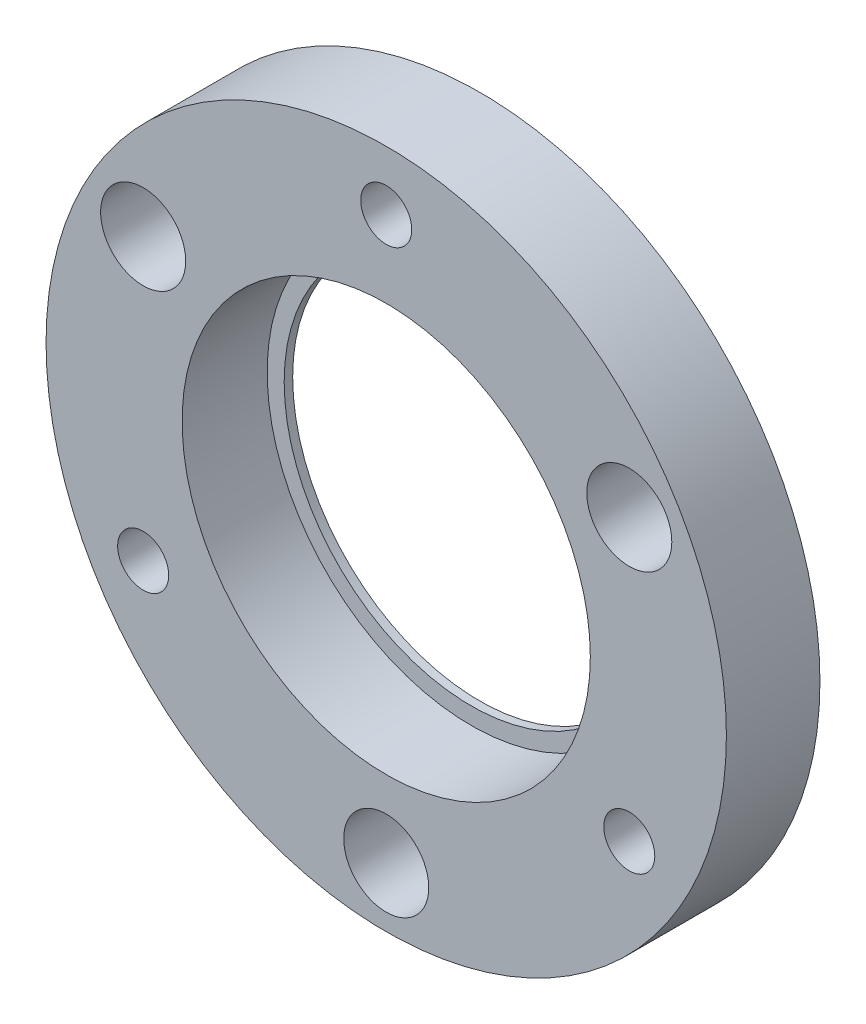
ISO-10303-21;
HEADER;
FILE_DESCRIPTION(('STEP AP214'),'2;1');
FILE_NAME('part.step','',(''),(''),'','','');
FILE_SCHEMA(('AUTOMOTIVE_DESIGN { 1 0 10303 214 1 1 1 1 }'));
ENDSEC;
DATA;
#1=APPLICATION_CONTEXT('core data for automotive mechanical design processes');
#2=APPLICATION_PROTOCOL_DEFINITION('international standard','automotive_design',2000,#1);
#3=PRODUCT_CONTEXT('',#1,'mechanical');
#4=PRODUCT('Part','Part','',(#3));
#5=PRODUCT_RELATED_PRODUCT_CATEGORY('part','',(#4));
#6=PRODUCT_DEFINITION_FORMATION('','',#4);
#7=PRODUCT_DEFINITION_CONTEXT('part definition',#1,'design');
#8=PRODUCT_DEFINITION('design','',#6,#7);
#9=PRODUCT_DEFINITION_SHAPE('','',#8);
#10=(LENGTH_UNIT() NAMED_UNIT(*) SI_UNIT(.MILLI.,.METRE.));
#11=(NAMED_UNIT(*) PLANE_ANGLE_UNIT() SI_UNIT($,.RADIAN.));
#12=(NAMED_UNIT(*) SI_UNIT($,.STERADIAN.) SOLID_ANGLE_UNIT());
#13=UNCERTAINTY_MEASURE_WITH_UNIT(LENGTH_MEASURE(1.E-05),#10,'distance_accuracy_value','');
#14=(GEOMETRIC_REPRESENTATION_CONTEXT(3) GLOBAL_UNCERTAINTY_ASSIGNED_CONTEXT((#13)) GLOBAL_UNIT_ASSIGNED_CONTEXT((#10,
#11,#12)) REPRESENTATION_CONTEXT('',''));
#15=CARTESIAN_POINT('',(0.,0.,0.));
#16=DIRECTION('',(0.,0.,1.));
#17=DIRECTION('',(1.,0.,0.));
#18=AXIS2_PLACEMENT_3D('',#15,#16,#17);
#19=CARTESIAN_POINT('',(0.,0.,5.));
#20=DIRECTION('',(0.,0.,-1.));
#21=DIRECTION('',(-1.,0.,0.));
#22=AXIS2_PLACEMENT_3D('',#19,#20,#21);
#23=CYLINDRICAL_SURFACE('',#22,12.);
#24=CARTESIAN_POINT('',(0.,0.,5.));
#25=DIRECTION('',(0.,0.,1.));
#26=DIRECTION('',(1.,0.,0.));
#27=AXIS2_PLACEMENT_3D('',#24,#25,#26);
#28=CIRCLE('',#27,12.);
#29=CARTESIAN_POINT('',(12.,0.,5.));
#30=VERTEX_POINT('',#29);
#31=EDGE_CURVE('E50',#30,#30,#28,.T.);
#32=ORIENTED_EDGE('',*,*,#31,.T.);
#33=EDGE_LOOP('',(#32));
#34=FACE_BOUND('',#33,.T.);
#35=CARTESIAN_POINT('',(0.,0.,0.));
#36=DIRECTION('',(0.,0.,1.));
#37=DIRECTION('',(1.,0.,0.));
#38=AXIS2_PLACEMENT_3D('',#35,#36,#37);
#39=CIRCLE('',#38,12.);
#40=CARTESIAN_POINT('',(12.,0.,0.));
#41=VERTEX_POINT('',#40);
#42=EDGE_CURVE('E45',#41,#41,#39,.T.);
#43=ORIENTED_EDGE('',*,*,#42,.F.);
#44=EDGE_LOOP('',(#43));
#45=FACE_BOUND('',#44,.T.);
#46=ADVANCED_FACE('F41',(#34,#45),#23,.F.);
#47=CARTESIAN_POINT('',(0.,16.5,5.));
#48=DIRECTION('',(0.,0.,-1.));
#49=DIRECTION('',(-1.,0.,0.));
#50=AXIS2_PLACEMENT_3D('',#47,#48,#49);
#51=CYLINDRICAL_SURFACE('',#50,1.5);
#52=CARTESIAN_POINT('',(0.,16.5,5.));
#53=DIRECTION('',(0.,0.,1.));
#54=DIRECTION('',(1.,0.,0.));
#55=AXIS2_PLACEMENT_3D('',#52,#53,#54);
#56=CIRCLE('',#55,1.5);
#57=CARTESIAN_POINT('',(1.5,16.5,5.));
#58=VERTEX_POINT('',#57);
#59=EDGE_CURVE('E56',#58,#58,#56,.T.);
#60=ORIENTED_EDGE('',*,*,#59,.T.);
#61=EDGE_LOOP('',(#60));
#62=FACE_BOUND('',#61,.T.);
#63=CARTESIAN_POINT('',(0.,16.5,-0.5));
#64=DIRECTION('',(0.,0.,1.));
#65=DIRECTION('',(1.,0.,0.));
#66=AXIS2_PLACEMENT_3D('',#63,#64,#65);
#67=CIRCLE('',#66,1.5);
#68=CARTESIAN_POINT('',(1.5,16.5,-0.5));
#69=VERTEX_POINT('',#68);
#70=EDGE_CURVE('E90',#69,#69,#67,.T.);
#71=ORIENTED_EDGE('',*,*,#70,.F.);
#72=EDGE_LOOP('',(#71));
#73=FACE_BOUND('',#72,.T.);
#74=ADVANCED_FACE('F136',(#62,#73),#51,.F.);
#75=CARTESIAN_POINT('',(14.2894191624432,-8.25,5.));
#76=DIRECTION('',(0.,0.,-1.));
#77=DIRECTION('',(-1.,0.,0.));
#78=AXIS2_PLACEMENT_3D('',#75,#76,#77);
#79=CYLINDRICAL_SURFACE('',#78,1.5);
#80=CARTESIAN_POINT('',(14.2894191624432,-8.25,5.));
#81=DIRECTION('',(0.,0.,1.));
#82=DIRECTION('',(1.,0.,0.));
#83=AXIS2_PLACEMENT_3D('',#80,#81,#82);
#84=CIRCLE('',#83,1.5);
#85=CARTESIAN_POINT('',(15.7894191624432,-8.25,5.));
#86=VERTEX_POINT('',#85);
#87=EDGE_CURVE('E62',#86,#86,#84,.T.);
#88=ORIENTED_EDGE('',*,*,#87,.T.);
#89=EDGE_LOOP('',(#88));
#90=FACE_BOUND('',#89,.T.);
#91=CARTESIAN_POINT('',(14.2894191624432,-8.25,-0.5));
#92=DIRECTION('',(0.,0.,1.));
#93=DIRECTION('',(1.,0.,0.));
#94=AXIS2_PLACEMENT_3D('',#91,#92,#93);
#95=CIRCLE('',#94,1.5);
#96=CARTESIAN_POINT('',(15.7894191624432,-8.25,-0.5));
#97=VERTEX_POINT('',#96);
#98=EDGE_CURVE('E94',#97,#97,#95,.T.);
#99=ORIENTED_EDGE('',*,*,#98,.F.);
#100=EDGE_LOOP('',(#99));
#101=FACE_BOUND('',#100,.T.);
#102=ADVANCED_FACE('F142',(#90,#101),#79,.F.);
#103=CARTESIAN_POINT('',(-14.2894191624432,-8.25000000000001,5.));
#104=DIRECTION('',(0.,0.,-1.));
#105=DIRECTION('',(-1.,0.,0.));
#106=AXIS2_PLACEMENT_3D('',#103,#104,#105);
#107=CYLINDRICAL_SURFACE('',#106,1.5);
#108=CARTESIAN_POINT('',(-14.2894191624432,-8.25000000000001,5.));
#109=DIRECTION('',(0.,0.,1.));
#110=DIRECTION('',(1.,0.,0.));
#111=AXIS2_PLACEMENT_3D('',#108,#109,#110);
#112=CIRCLE('',#111,1.5);
#113=CARTESIAN_POINT('',(-12.7894191624432,-8.25000000000001,5.));
#114=VERTEX_POINT('',#113);
#115=EDGE_CURVE('E65',#114,#114,#112,.T.);
#116=ORIENTED_EDGE('',*,*,#115,.T.);
#117=EDGE_LOOP('',(#116));
#118=FACE_BOUND('',#117,.T.);
#119=CARTESIAN_POINT('',(-14.2894191624432,-8.25000000000001,-0.5));
#120=DIRECTION('',(0.,0.,1.));
#121=DIRECTION('',(1.,0.,0.));
#122=AXIS2_PLACEMENT_3D('',#119,#120,#121);
#123=CIRCLE('',#122,1.5);
#124=CARTESIAN_POINT('',(-12.7894191624432,-8.25000000000001,-0.5));
#125=VERTEX_POINT('',#124);
#126=EDGE_CURVE('E98',#125,#125,#123,.T.);
#127=ORIENTED_EDGE('',*,*,#126,.F.);
#128=EDGE_LOOP('',(#127));
#129=FACE_BOUND('',#128,.T.);
#130=ADVANCED_FACE('F151',(#118,#129),#107,.F.);
#131=CARTESIAN_POINT('',(0.,-16.5,5.));
#132=DIRECTION('',(0.,0.,-1.));
#133=DIRECTION('',(-1.,0.,0.));
#134=AXIS2_PLACEMENT_3D('',#131,#132,#133);
#135=CYLINDRICAL_SURFACE('',#134,2.5);
#136=CARTESIAN_POINT('',(0.,-16.5,5.));
#137=DIRECTION('',(0.,0.,1.));
#138=DIRECTION('',(1.,0.,0.));
#139=AXIS2_PLACEMENT_3D('',#136,#137,#138);
#140=CIRCLE('',#139,2.5);
#141=CARTESIAN_POINT('',(2.5,-16.5,5.));
#142=VERTEX_POINT('',#141);
#143=EDGE_CURVE('E69',#142,#142,#140,.T.);
#144=ORIENTED_EDGE('',*,*,#143,.T.);
#145=EDGE_LOOP('',(#144));
#146=FACE_BOUND('',#145,.T.);
#147=CARTESIAN_POINT('',(0.,-16.5,-0.5));
#148=DIRECTION('',(0.,0.,1.));
#149=DIRECTION('',(1.,0.,0.));
#150=AXIS2_PLACEMENT_3D('',#147,#148,#149);
#151=CIRCLE('',#150,2.5);
#152=CARTESIAN_POINT('',(2.5,-16.5,-0.5));
#153=VERTEX_POINT('',#152);
#154=EDGE_CURVE('E102',#153,#153,#151,.T.);
#155=ORIENTED_EDGE('',*,*,#154,.F.);
#156=EDGE_LOOP('',(#155));
#157=FACE_BOUND('',#156,.T.);
#158=ADVANCED_FACE('F155',(#146,#157),#135,.F.);
#159=CARTESIAN_POINT('',(-14.2894191624432,8.25,5.));
#160=DIRECTION('',(0.,0.,-1.));
#161=DIRECTION('',(-1.,0.,0.));
#162=AXIS2_PLACEMENT_3D('',#159,#160,#161);
#163=CYLINDRICAL_SURFACE('',#162,2.5);
#164=CARTESIAN_POINT('',(-14.2894191624432,8.25,5.));
#165=DIRECTION('',(0.,0.,1.));
#166=DIRECTION('',(1.,0.,0.));
#167=AXIS2_PLACEMENT_3D('',#164,#165,#166);
#168=CIRCLE('',#167,2.5);
#169=CARTESIAN_POINT('',(-11.7894191624432,8.25,5.));
#170=VERTEX_POINT('',#169);
#171=EDGE_CURVE('E73',#170,#170,#168,.T.);
#172=ORIENTED_EDGE('',*,*,#171,.T.);
#173=EDGE_LOOP('',(#172));
#174=FACE_BOUND('',#173,.T.);
#175=CARTESIAN_POINT('',(-14.2894191624432,8.25,-0.5));
#176=DIRECTION('',(0.,0.,1.));
#177=DIRECTION('',(1.,0.,0.));
#178=AXIS2_PLACEMENT_3D('',#175,#176,#177);
#179=CIRCLE('',#178,2.5);
#180=CARTESIAN_POINT('',(-11.7894191624432,8.25,-0.5));
#181=VERTEX_POINT('',#180);
#182=EDGE_CURVE('E106',#181,#181,#179,.T.);
#183=ORIENTED_EDGE('',*,*,#182,.F.);
#184=EDGE_LOOP('',(#183));
#185=FACE_BOUND('',#184,.T.);
#186=ADVANCED_FACE('F158',(#174,#185),#163,.F.);
#187=CARTESIAN_POINT('',(14.2894191624432,8.25000000000001,5.));
#188=DIRECTION('',(0.,0.,-1.));
#189=DIRECTION('',(-1.,0.,0.));
#190=AXIS2_PLACEMENT_3D('',#187,#188,#189);
#191=CYLINDRICAL_SURFACE('',#190,2.5);
#192=CARTESIAN_POINT('',(14.2894191624432,8.25000000000001,5.));
#193=DIRECTION('',(0.,0.,1.));
#194=DIRECTION('',(1.,0.,0.));
#195=AXIS2_PLACEMENT_3D('',#192,#193,#194);
#196=CIRCLE('',#195,2.5);
#197=CARTESIAN_POINT('',(16.7894191624432,8.25000000000001,5.));
#198=VERTEX_POINT('',#197);
#199=EDGE_CURVE('E77',#198,#198,#196,.T.);
#200=ORIENTED_EDGE('',*,*,#199,.T.);
#201=EDGE_LOOP('',(#200));
#202=FACE_BOUND('',#201,.T.);
#203=CARTESIAN_POINT('',(14.2894191624432,8.25000000000001,-0.5));
#204=DIRECTION('',(0.,0.,1.));
#205=DIRECTION('',(1.,0.,0.));
#206=AXIS2_PLACEMENT_3D('',#203,#204,#205);
#207=CIRCLE('',#206,2.5);
#208=CARTESIAN_POINT('',(16.7894191624432,8.25000000000001,-0.5));
#209=VERTEX_POINT('',#208);
#210=EDGE_CURVE('E110',#209,#209,#207,.T.);
#211=ORIENTED_EDGE('',*,*,#210,.F.);
#212=EDGE_LOOP('',(#211));
#213=FACE_BOUND('',#212,.T.);
#214=ADVANCED_FACE('F43',(#202,#213),#191,.F.);
#215=CARTESIAN_POINT('',(0.,0.,5.));
#216=DIRECTION('',(0.,0.,-1.));
#217=DIRECTION('',(-1.,0.,0.));
#218=AXIS2_PLACEMENT_3D('',#215,#216,#217);
#219=CYLINDRICAL_SURFACE('',#218,20.);
#220=CARTESIAN_POINT('',(0.,0.,5.));
#221=DIRECTION('',(0.,0.,1.));
#222=DIRECTION('',(1.,0.,0.));
#223=AXIS2_PLACEMENT_3D('',#220,#221,#222);
#224=CIRCLE('',#223,20.);
#225=CARTESIAN_POINT('',(20.,0.,5.));
#226=VERTEX_POINT('',#225);
#227=EDGE_CURVE('E10',#226,#226,#224,.T.);
#228=ORIENTED_EDGE('',*,*,#227,.F.);
#229=EDGE_LOOP('',(#228));
#230=FACE_BOUND('',#229,.T.);
#231=CARTESIAN_POINT('',(0.,0.,-0.5));
#232=DIRECTION('',(0.,0.,1.));
#233=DIRECTION('',(1.,0.,0.));
#234=AXIS2_PLACEMENT_3D('',#231,#232,#233);
#235=CIRCLE('',#234,20.);
#236=CARTESIAN_POINT('',(20.,0.,-0.5));
#237=VERTEX_POINT('',#236);
#238=EDGE_CURVE('E86',#237,#237,#235,.T.);
#239=ORIENTED_EDGE('',*,*,#238,.T.);
#240=EDGE_LOOP('',(#239));
#241=FACE_BOUND('',#240,.T.);
#242=ADVANCED_FACE('F146',(#230,#241),#219,.T.);
#243=CARTESIAN_POINT('',(0.,0.,5.));
#244=DIRECTION('',(0.,0.,1.));
#245=DIRECTION('',(1.,0.,0.));
#246=AXIS2_PLACEMENT_3D('',#243,#244,#245);
#247=PLANE('',#246);
#248=ORIENTED_EDGE('',*,*,#199,.F.);
#249=EDGE_LOOP('',(#248));
#250=FACE_BOUND('',#249,.T.);
#251=ORIENTED_EDGE('',*,*,#171,.F.);
#252=EDGE_LOOP('',(#251));
#253=FACE_BOUND('',#252,.T.);
#254=ORIENTED_EDGE('',*,*,#143,.F.);
#255=EDGE_LOOP('',(#254));
#256=FACE_BOUND('',#255,.T.);
#257=ORIENTED_EDGE('',*,*,#115,.F.);
#258=EDGE_LOOP('',(#257));
#259=FACE_BOUND('',#258,.T.);
#260=ORIENTED_EDGE('',*,*,#87,.F.);
#261=EDGE_LOOP('',(#260));
#262=FACE_BOUND('',#261,.T.);
#263=ORIENTED_EDGE('',*,*,#59,.F.);
#264=EDGE_LOOP('',(#263));
#265=FACE_BOUND('',#264,.T.);
#266=ORIENTED_EDGE('',*,*,#31,.F.);
#267=EDGE_LOOP('',(#266));
#268=FACE_BOUND('',#267,.T.);
#269=ORIENTED_EDGE('',*,*,#227,.T.);
#270=EDGE_LOOP('',(#269));
#271=FACE_BOUND('',#270,.T.);
#272=ADVANCED_FACE('F129',(#250,#253,#256,#259,#262,#265,#268,#271),#247,.T.);
#273=CARTESIAN_POINT('',(0.,0.,0.));
#274=DIRECTION('',(0.,0.,1.));
#275=DIRECTION('',(1.,0.,0.));
#276=AXIS2_PLACEMENT_3D('',#273,#274,#275);
#277=PLANE('',#276);
#278=CARTESIAN_POINT('',(0.,0.,0.));
#279=DIRECTION('',(0.,0.,1.));
#280=DIRECTION('',(1.,0.,0.));
#281=AXIS2_PLACEMENT_3D('',#278,#279,#280);
#282=CIRCLE('',#281,11.);
#283=CARTESIAN_POINT('',(11.,0.,0.));
#284=VERTEX_POINT('',#283);
#285=EDGE_CURVE('E81',#284,#284,#282,.T.);
#286=ORIENTED_EDGE('',*,*,#285,.F.);
#287=EDGE_LOOP('',(#286));
#288=FACE_BOUND('',#287,.T.);
#289=ORIENTED_EDGE('',*,*,#42,.T.);
#290=EDGE_LOOP('',(#289));
#291=FACE_BOUND('',#290,.T.);
#292=ADVANCED_FACE('F123',(#288,#291),#277,.T.);
#293=CARTESIAN_POINT('',(0.,0.,-0.5));
#294=DIRECTION('',(0.,0.,1.));
#295=DIRECTION('',(1.,0.,0.));
#296=AXIS2_PLACEMENT_3D('',#293,#294,#295);
#297=CYLINDRICAL_SURFACE('',#296,11.);
#298=CARTESIAN_POINT('',(0.,0.,-0.5));
#299=DIRECTION('',(0.,0.,1.));
#300=DIRECTION('',(1.,0.,0.));
#301=AXIS2_PLACEMENT_3D('',#298,#299,#300);
#302=CIRCLE('',#301,11.);
#303=CARTESIAN_POINT('',(11.,0.,-0.5));
#304=VERTEX_POINT('',#303);
#305=EDGE_CURVE('E85',#304,#304,#302,.T.);
#306=ORIENTED_EDGE('',*,*,#305,.F.);
#307=EDGE_LOOP('',(#306));
#308=FACE_BOUND('',#307,.T.);
#309=ORIENTED_EDGE('',*,*,#285,.T.);
#310=EDGE_LOOP('',(#309));
#311=FACE_BOUND('',#310,.T.);
#312=ADVANCED_FACE('F120',(#308,#311),#297,.F.);
#313=CARTESIAN_POINT('',(0.,0.,-0.5));
#314=DIRECTION('',(0.,0.,1.));
#315=DIRECTION('',(1.,0.,0.));
#316=AXIS2_PLACEMENT_3D('',#313,#314,#315);
#317=PLANE('',#316);
#318=ORIENTED_EDGE('',*,*,#305,.T.);
#319=EDGE_LOOP('',(#318));
#320=FACE_BOUND('',#319,.T.);
#321=ORIENTED_EDGE('',*,*,#210,.T.);
#322=EDGE_LOOP('',(#321));
#323=FACE_BOUND('',#322,.T.);
#324=ORIENTED_EDGE('',*,*,#182,.T.);
#325=EDGE_LOOP('',(#324));
#326=FACE_BOUND('',#325,.T.);
#327=ORIENTED_EDGE('',*,*,#154,.T.);
#328=EDGE_LOOP('',(#327));
#329=FACE_BOUND('',#328,.T.);
#330=ORIENTED_EDGE('',*,*,#126,.T.);
#331=EDGE_LOOP('',(#330));
#332=FACE_BOUND('',#331,.T.);
#333=ORIENTED_EDGE('',*,*,#98,.T.);
#334=EDGE_LOOP('',(#333));
#335=FACE_BOUND('',#334,.T.);
#336=ORIENTED_EDGE('',*,*,#70,.T.);
#337=EDGE_LOOP('',(#336));
#338=FACE_BOUND('',#337,.T.);
#339=ORIENTED_EDGE('',*,*,#238,.F.);
#340=EDGE_LOOP('',(#339));
#341=FACE_BOUND('',#340,.T.);
#342=ADVANCED_FACE('F117',(#320,#323,#326,#329,#332,#335,#338,#341),#317,.F.);
#343=CLOSED_SHELL('',(#46,#74,#102,#130,#158,#186,#214,#242,#272,#292,#312,#342));
#344=MANIFOLD_SOLID_BREP('B2',#343);
#345=ADVANCED_BREP_SHAPE_REPRESENTATION('',(#18,#344),#14);
#346=SHAPE_DEFINITION_REPRESENTATION(#9,#345);
ENDSEC;
END-ISO-10303-21;
